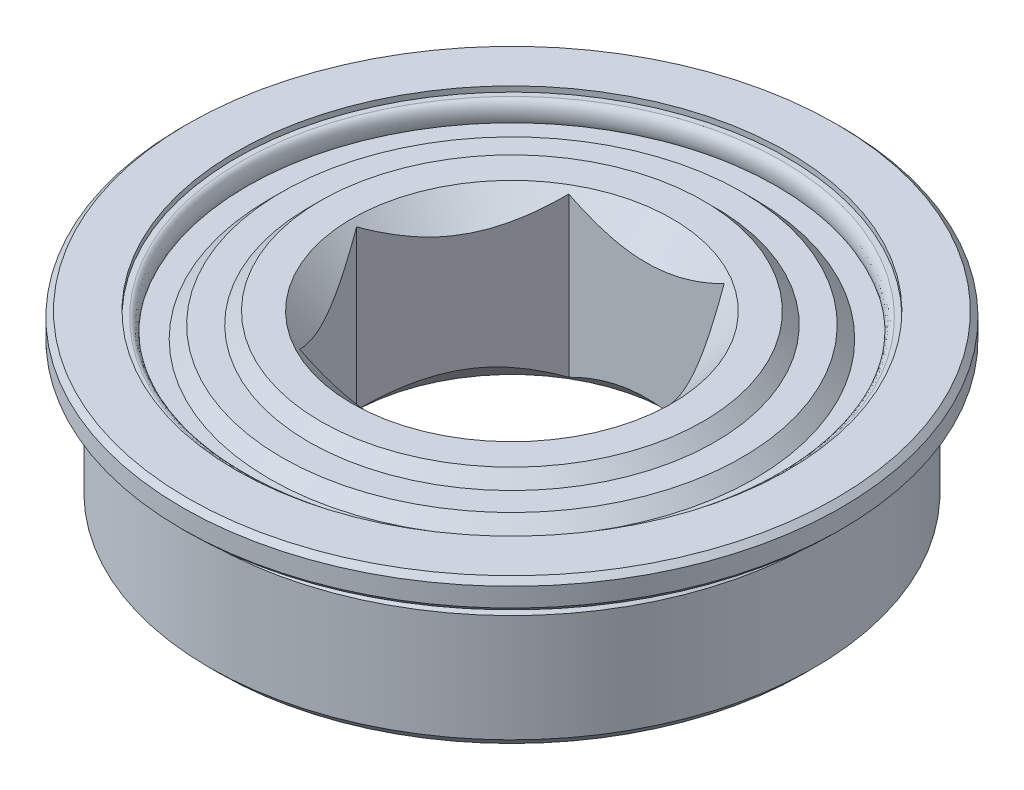
ISO-10303-21;
HEADER;
FILE_DESCRIPTION(('STEP AP214'),'2;1');
FILE_NAME('part.step','',(''),(''),'','','');
FILE_SCHEMA(('AUTOMOTIVE_DESIGN { 1 0 10303 214 1 1 1 1 }'));
ENDSEC;
DATA;
#1=APPLICATION_CONTEXT('core data for automotive mechanical design processes');
#2=APPLICATION_PROTOCOL_DEFINITION('international standard','automotive_design',2000,#1);
#3=PRODUCT_CONTEXT('',#1,'mechanical');
#4=PRODUCT('Part','Part','',(#3));
#5=PRODUCT_RELATED_PRODUCT_CATEGORY('part','',(#4));
#6=PRODUCT_DEFINITION_FORMATION('','',#4);
#7=PRODUCT_DEFINITION_CONTEXT('part definition',#1,'design');
#8=PRODUCT_DEFINITION('design','',#6,#7);
#9=PRODUCT_DEFINITION_SHAPE('','',#8);
#10=(LENGTH_UNIT() NAMED_UNIT(*) SI_UNIT(.MILLI.,.METRE.));
#11=(NAMED_UNIT(*) PLANE_ANGLE_UNIT() SI_UNIT($,.RADIAN.));
#12=(NAMED_UNIT(*) SI_UNIT($,.STERADIAN.) SOLID_ANGLE_UNIT());
#13=UNCERTAINTY_MEASURE_WITH_UNIT(LENGTH_MEASURE(1.E-05),#10,'distance_accuracy_value','');
#14=(GEOMETRIC_REPRESENTATION_CONTEXT(3) GLOBAL_UNCERTAINTY_ASSIGNED_CONTEXT((#13)) GLOBAL_UNIT_ASSIGNED_CONTEXT((#10,
#11,#12)) REPRESENTATION_CONTEXT('',''));
#15=CARTESIAN_POINT('',(0.,0.,0.));
#16=DIRECTION('',(0.,0.,1.));
#17=DIRECTION('',(1.,0.,0.));
#18=AXIS2_PLACEMENT_3D('',#15,#16,#17);
#19=CARTESIAN_POINT('',(0.,-1.524,0.));
#20=DIRECTION('',(0.,-1.,0.));
#21=DIRECTION('',(0.,0.,-1.));
#22=AXIS2_PLACEMENT_3D('',#19,#20,#21);
#23=TOROIDAL_SURFACE('',#22,14.224,0.127);
#24=CARTESIAN_POINT('',(0.,-1.524,0.));
#25=DIRECTION('',(0.,-1.,0.));
#26=DIRECTION('',(0.,0.,-1.));
#27=AXIS2_PLACEMENT_3D('',#24,#25,#26);
#28=CIRCLE('',#27,14.097);
#29=CARTESIAN_POINT('',(0.,-1.524,-14.097));
#30=VERTEX_POINT('',#29);
#31=EDGE_CURVE('E196',#30,#30,#28,.T.);
#32=ORIENTED_EDGE('',*,*,#31,.F.);
#33=EDGE_LOOP('',(#32));
#34=FACE_BOUND('',#33,.T.);
#35=CARTESIAN_POINT('',(0.,-1.397,0.));
#36=DIRECTION('',(0.,1.,0.));
#37=DIRECTION('',(0.,0.,-1.));
#38=AXIS2_PLACEMENT_3D('',#35,#36,#37);
#39=CIRCLE('',#38,14.224);
#40=CARTESIAN_POINT('',(0.,-1.397,-14.224));
#41=VERTEX_POINT('',#40);
#42=EDGE_CURVE('E195',#41,#41,#39,.T.);
#43=ORIENTED_EDGE('',*,*,#42,.F.);
#44=EDGE_LOOP('',(#43));
#45=FACE_BOUND('',#44,.T.);
#46=ADVANCED_FACE('F16',(#34,#45),#23,.F.);
#47=CARTESIAN_POINT('',(7.33234841870825,-7.9375,0.));
#48=DIRECTION('',(0.866025403784439,0.,-0.5));
#49=DIRECTION('',(0.,-1.,0.));
#50=AXIS2_PLACEMENT_3D('',#47,#48,#49);
#51=PLANE('',#50);
#52=CARTESIAN_POINT('',(7.33234841870825,-0.22415158129175,0.));
#53=CARTESIAN_POINT('',(6.86885874856062,-0.68764125143938,-0.802787657479035));
#54=CARTESIAN_POINT('',(6.44960705918636,-0.928142123320571,-1.52895288463434));
#55=CARTESIAN_POINT('',(5.96795144312518,-1.20444058208666,-2.36320488340318));
#56=CARTESIAN_POINT('',(5.50600984993854,-1.2064856558471,-3.16331119293176));
#57=CARTESIAN_POINT('',(5.04374558814999,-1.20853215810218,-3.96397638087285));
#58=CARTESIAN_POINT('',(4.5611815986816,-0.935135019167009,-4.79980172853524));
#59=CARTESIAN_POINT('',(4.13662420852037,-0.694601580458219,-5.53515669902333));
#60=CARTESIAN_POINT('',(3.66617420935412,-0.224151581291739,-6.35000000000001));
#61=B_SPLINE_CURVE_WITH_KNOTS('',2,(#52,#53,#54,#55,#56,#57,#58,#59,#60),.UNSPECIFIED.,.F.,.F.,
(3,2,2,2,3),(0.,0.25,0.5,0.75,1.),.UNSPECIFIED.);
#62=CARTESIAN_POINT('',(7.33234841870825,-0.224151581291754,0.));
#63=VERTEX_POINT('',#62);
#64=CARTESIAN_POINT('',(3.66617420935412,-0.224151581291751,-6.35));
#65=VERTEX_POINT('',#64);
#66=EDGE_CURVE('E491',#63,#65,#61,.T.);
#67=ORIENTED_EDGE('',*,*,#66,.T.);
#68=DIRECTION('',(0.,1.,0.));
#69=VECTOR('',#68,1.);
#70=CARTESIAN_POINT('',(3.66617420935412,-7.9375,-6.35));
#71=LINE('',#70,#69);
#72=CARTESIAN_POINT('',(3.66617420935412,-7.71334841870825,-6.35));
#73=VERTEX_POINT('',#72);
#74=EDGE_CURVE('E11',#73,#65,#71,.T.);
#75=ORIENTED_EDGE('',*,*,#74,.F.);
#76=CARTESIAN_POINT('',(3.66617420935412,-7.71334841870824,-6.35000000000001));
#77=CARTESIAN_POINT('',(4.12966387950616,-7.24985874855621,-5.54721234251334));
#78=CARTESIAN_POINT('',(4.54891556887601,-7.00935787667942,-4.82104711536568));
#79=CARTESIAN_POINT('',(5.03057118494097,-6.73305941791331,-3.98679511659028));
#80=CARTESIAN_POINT('',(5.49251277812383,-6.73101434415289,-3.18668880706825));
#81=CARTESIAN_POINT('',(5.95477703991218,-6.72896784189781,-2.38602361912751));
#82=CARTESIAN_POINT('',(6.43734102938077,-7.00236498083298,-1.55019827146477));
#83=CARTESIAN_POINT('',(6.86189841954177,-7.24289841954153,-0.814843300977084));
#84=CARTESIAN_POINT('',(7.33234841870825,-7.71334841870824,0.));
#85=B_SPLINE_CURVE_WITH_KNOTS('',2,(#76,#77,#78,#79,#80,#81,#82,#83,#84),.UNSPECIFIED.,.F.,.F.,
(3,2,2,2,3),(0.,0.25,0.5,0.75,1.),.UNSPECIFIED.);
#86=CARTESIAN_POINT('',(7.33234841870825,-7.71334841870825,0.));
#87=VERTEX_POINT('',#86);
#88=EDGE_CURVE('E1245',#73,#87,#85,.T.);
#89=ORIENTED_EDGE('',*,*,#88,.T.);
#90=DIRECTION('',(0.,1.,0.));
#91=VECTOR('',#90,1.);
#92=CARTESIAN_POINT('',(7.33234841870825,-7.9375,0.));
#93=LINE('',#92,#91);
#94=EDGE_CURVE('E214',#87,#63,#93,.T.);
#95=ORIENTED_EDGE('',*,*,#94,.T.);
#96=EDGE_LOOP('',(#67,#75,#89,#95));
#97=FACE_BOUND('',#96,.T.);
#98=ADVANCED_FACE('F331',(#97),#51,.F.);
#99=CARTESIAN_POINT('',(3.66617420935412,-7.9375,-6.35));
#100=DIRECTION('',(0.,0.,-1.));
#101=DIRECTION('',(-1.,0.,0.));
#102=AXIS2_PLACEMENT_3D('',#99,#100,#101);
#103=PLANE('',#102);
#104=CARTESIAN_POINT('',(3.66617420935412,-0.22415158129174,-6.35));
#105=CARTESIAN_POINT('',(2.73227432110119,-0.69110152541821,-6.35));
#106=CARTESIAN_POINT('',(1.88795550411408,-0.93178295053179,-6.35));
#107=CARTESIAN_POINT('',(0.925627723468545,-1.20610399728834,-6.35));
#108=CARTESIAN_POINT('',(0.00216765710562509,-1.20649963002069,-6.35));
#109=CARTESIAN_POINT('',(-0.92177943687831,-1.20689547140752,-6.35));
#110=CARTESIAN_POINT('',(-1.8867218260932,-0.93213442667476,-6.35));
#111=CARTESIAN_POINT('',(-2.7310323176977,-0.69172252711998,-6.35));
#112=CARTESIAN_POINT('',(-3.66617420935413,-0.22415158129174,-6.35));
#113=B_SPLINE_CURVE_WITH_KNOTS('',2,(#104,#105,#106,#107,#108,#109,#110,#111,#112),
.UNSPECIFIED.,.F.,.F.,(3,2,2,2,3),(0.,0.25,0.5,0.75,1.),.UNSPECIFIED.);
#114=CARTESIAN_POINT('',(-3.66617420935413,-0.224151581291746,-6.35));
#115=VERTEX_POINT('',#114);
#116=EDGE_CURVE('E497',#65,#115,#113,.T.);
#117=ORIENTED_EDGE('',*,*,#116,.T.);
#118=DIRECTION('',(0.,1.,0.));
#119=VECTOR('',#118,1.);
#120=CARTESIAN_POINT('',(-3.66617420935413,-7.9375,-6.35));
#121=LINE('',#120,#119);
#122=CARTESIAN_POINT('',(-3.66617420935413,-7.71334841870826,-6.35));
#123=VERTEX_POINT('',#122);
#124=EDGE_CURVE('E29',#123,#115,#121,.T.);
#125=ORIENTED_EDGE('',*,*,#124,.F.);
#126=CARTESIAN_POINT('',(-3.66617420935413,-7.71334841870825,-6.35));
#127=CARTESIAN_POINT('',(-2.73160048914318,-7.24606155860275,-6.35));
#128=CARTESIAN_POINT('',(-1.8867218260932,-7.00536557332522,-6.35));
#129=CARTESIAN_POINT('',(-0.9228354387176,-6.73076568833412,-6.35));
#130=CARTESIAN_POINT('',(0.00216765710562986,-6.73100036997929,-6.35));
#131=CARTESIAN_POINT('',(0.92456619557612,-6.73123439082472,-6.35));
#132=CARTESIAN_POINT('',(1.88795550411408,-7.0057170494682,-6.35));
#133=CARTESIAN_POINT('',(2.73169984620938,-7.24611123713587,-6.35));
#134=CARTESIAN_POINT('',(3.66617420935412,-7.71334841870824,-6.35));
#135=B_SPLINE_CURVE_WITH_KNOTS('',2,(#126,#127,#128,#129,#130,#131,#132,#133,#134),
.UNSPECIFIED.,.F.,.F.,(3,2,2,2,3),(0.,0.25,0.5,0.75,1.),.UNSPECIFIED.);
#136=EDGE_CURVE('E1237',#123,#73,#135,.T.);
#137=ORIENTED_EDGE('',*,*,#136,.T.);
#138=ORIENTED_EDGE('',*,*,#74,.T.);
#139=EDGE_LOOP('',(#117,#125,#137,#138));
#140=FACE_BOUND('',#139,.T.);
#141=ADVANCED_FACE('F960',(#140),#103,.F.);
#142=CARTESIAN_POINT('',(-3.66617420935413,-7.9375,-6.35));
#143=DIRECTION('',(-0.866025403784439,0.,-0.5));
#144=DIRECTION('',(-0.5,0.,0.866025403784439));
#145=AXIS2_PLACEMENT_3D('',#142,#143,#144);
#146=PLANE('',#145);
#147=CARTESIAN_POINT('',(-3.66617420935413,-0.224151581291737,-6.35));
#148=CARTESIAN_POINT('',(-4.12966387950116,-0.687641251438776,-5.54721234252199));
#149=CARTESIAN_POINT('',(-4.54891556887602,-0.928142123320557,-4.82104711536567));
#150=CARTESIAN_POINT('',(-5.03057118493667,-1.20444058208665,-3.98679511659772));
#151=CARTESIAN_POINT('',(-5.49251277812383,-1.20648565584709,-3.18668880706824));
#152=CARTESIAN_POINT('',(-5.95477703991238,-1.20853215810217,-2.38602361912716));
#153=CARTESIAN_POINT('',(-6.43734102938078,-0.935135019166996,-1.55019827146476));
#154=CARTESIAN_POINT('',(-6.861898419542,-0.694601580458217,-0.814843300976677));
#155=CARTESIAN_POINT('',(-7.33234841870825,-0.224151581291737,0.));
#156=B_SPLINE_CURVE_WITH_KNOTS('',2,(#147,#148,#149,#150,#151,#152,#153,#154,#155),
.UNSPECIFIED.,.F.,.F.,(3,2,2,2,3),(0.,0.25,0.5,0.75,1.),.UNSPECIFIED.);
#157=CARTESIAN_POINT('',(-7.33234841870825,-0.224151581291749,0.));
#158=VERTEX_POINT('',#157);
#159=EDGE_CURVE('E503',#115,#158,#156,.T.);
#160=ORIENTED_EDGE('',*,*,#159,.T.);
#161=DIRECTION('',(0.,1.,0.));
#162=VECTOR('',#161,1.);
#163=CARTESIAN_POINT('',(-7.33234841870825,-7.9375,0.));
#164=LINE('',#163,#162);
#165=CARTESIAN_POINT('',(-7.33234841870825,-7.71334841870825,0.));
#166=VERTEX_POINT('',#165);
#167=EDGE_CURVE('E409',#166,#158,#164,.T.);
#168=ORIENTED_EDGE('',*,*,#167,.F.);
#169=CARTESIAN_POINT('',(-7.33234841870825,-7.71334841870825,0.));
#170=CARTESIAN_POINT('',(-6.86885874856335,-7.24985874856334,-0.80278765747431));
#171=CARTESIAN_POINT('',(-6.44960705918636,-7.00935787667942,-1.52895288463433));
#172=CARTESIAN_POINT('',(-5.96795144312366,-6.73305941791111,-2.36320488340584));
#173=CARTESIAN_POINT('',(-5.50600984993855,-6.7310143441529,-3.16331119293176));
#174=CARTESIAN_POINT('',(-5.0437455881457,-6.72896784190002,-3.9639763808803));
#175=CARTESIAN_POINT('',(-4.56118159868161,-7.00236498083299,-4.79980172853523));
#176=CARTESIAN_POINT('',(-4.13662420851991,-7.24289841954224,-5.53515669902414));
#177=CARTESIAN_POINT('',(-3.66617420935413,-7.71334841870825,-6.35));
#178=B_SPLINE_CURVE_WITH_KNOTS('',2,(#169,#170,#171,#172,#173,#174,#175,#176,#177),
.UNSPECIFIED.,.F.,.F.,(3,2,2,2,3),(0.,0.25,0.5,0.75,1.),.UNSPECIFIED.);
#179=EDGE_CURVE('E1239',#166,#123,#178,.T.);
#180=ORIENTED_EDGE('',*,*,#179,.T.);
#181=ORIENTED_EDGE('',*,*,#124,.T.);
#182=EDGE_LOOP('',(#160,#168,#180,#181));
#183=FACE_BOUND('',#182,.T.);
#184=ADVANCED_FACE('F383',(#183),#146,.F.);
#185=CARTESIAN_POINT('',(-7.33234841870825,-7.9375,0.));
#186=DIRECTION('',(-0.866025403784439,0.,0.5));
#187=DIRECTION('',(0.,1.,0.));
#188=AXIS2_PLACEMENT_3D('',#185,#186,#187);
#189=PLANE('',#188);
#190=CARTESIAN_POINT('',(-7.33234841870825,-0.22415158129174,0.));
#191=CARTESIAN_POINT('',(-6.86885874856026,-0.68764125143973,0.802787657479657));
#192=CARTESIAN_POINT('',(-6.44960705918636,-0.928142123320571,1.52895288463434));
#193=CARTESIAN_POINT('',(-5.96795144312488,-1.20444058208666,2.36320488340372));
#194=CARTESIAN_POINT('',(-5.50600984993854,-1.20648565584709,3.16331119293176));
#195=CARTESIAN_POINT('',(-5.04374558815039,-1.20853215810217,3.96397638087217));
#196=CARTESIAN_POINT('',(-4.5611815986816,-0.935135019167,4.79980172853524));
#197=CARTESIAN_POINT('',(-4.13662420852084,-0.69460158045868,5.53515669902252));
#198=CARTESIAN_POINT('',(-3.66617420935413,-0.22415158129174,6.35));
#199=B_SPLINE_CURVE_WITH_KNOTS('',2,(#190,#191,#192,#193,#194,#195,#196,#197,#198),
.UNSPECIFIED.,.F.,.F.,(3,2,2,2,3),(0.,0.25,0.5,0.75,1.),.UNSPECIFIED.);
#200=CARTESIAN_POINT('',(-3.66617420935413,-0.224151581291752,6.35));
#201=VERTEX_POINT('',#200);
#202=EDGE_CURVE('E263',#158,#201,#199,.T.);
#203=ORIENTED_EDGE('',*,*,#202,.T.);
#204=DIRECTION('',(0.,1.,0.));
#205=VECTOR('',#204,1.);
#206=CARTESIAN_POINT('',(-3.66617420935413,-7.9375,6.35));
#207=LINE('',#206,#205);
#208=CARTESIAN_POINT('',(-3.66617420935413,-7.71334841870825,6.35));
#209=VERTEX_POINT('',#208);
#210=EDGE_CURVE('E593',#209,#201,#207,.T.);
#211=ORIENTED_EDGE('',*,*,#210,.F.);
#212=CARTESIAN_POINT('',(-3.66617420935412,-7.71334841870824,6.35));
#213=CARTESIAN_POINT('',(-4.12966387951137,-7.249858748551,5.54721234250431));
#214=CARTESIAN_POINT('',(-4.54891556887601,-7.00935787667942,4.82104711536567));
#215=CARTESIAN_POINT('',(-5.03057118494938,-6.73305941791106,3.9867951165757));
#216=CARTESIAN_POINT('',(-5.49251277812383,-6.7310143441529,3.18668880706825));
#217=CARTESIAN_POINT('',(-5.95477703991627,-6.72896784190002,2.38602361912041));
#218=CARTESIAN_POINT('',(-6.43734102938077,-7.00236498083299,1.55019827146477));
#219=CARTESIAN_POINT('',(-6.861898419542,-7.24289841954177,0.814843300976686));
#220=CARTESIAN_POINT('',(-7.33234841870825,-7.71334841870825,0.));
#221=B_SPLINE_CURVE_WITH_KNOTS('',2,(#212,#213,#214,#215,#216,#217,#218,#219,#220),
.UNSPECIFIED.,.F.,.F.,(3,2,2,2,3),(0.,0.25,0.5,0.75,1.),.UNSPECIFIED.);
#222=EDGE_CURVE('E404',#209,#166,#221,.T.);
#223=ORIENTED_EDGE('',*,*,#222,.T.);
#224=ORIENTED_EDGE('',*,*,#167,.T.);
#225=EDGE_LOOP('',(#203,#211,#223,#224));
#226=FACE_BOUND('',#225,.T.);
#227=ADVANCED_FACE('F289',(#226),#189,.F.);
#228=CARTESIAN_POINT('',(-3.66617420935413,-7.9375,6.35));
#229=DIRECTION('',(0.,0.,1.));
#230=DIRECTION('',(0.,-1.,0.));
#231=AXIS2_PLACEMENT_3D('',#228,#229,#230);
#232=PLANE('',#231);
#233=CARTESIAN_POINT('',(-3.66617420935413,-0.22415158129174,6.35));
#234=CARTESIAN_POINT('',(-2.73160048914295,-0.69143844139736,6.35));
#235=CARTESIAN_POINT('',(-1.8867218260932,-0.93213442667477,6.35));
#236=CARTESIAN_POINT('',(-0.922835438717395,-1.20673431166587,6.35));
#237=CARTESIAN_POINT('',(0.00216765710562509,-1.2064996300207,6.35));
#238=CARTESIAN_POINT('',(0.924566195573501,-1.20626560917527,6.35));
#239=CARTESIAN_POINT('',(1.88795550411409,-0.93178295053179,6.35));
#240=CARTESIAN_POINT('',(2.73169984620637,-0.691388762865629,6.35));
#241=CARTESIAN_POINT('',(3.66617420935412,-0.22415158129174,6.35));
#242=B_SPLINE_CURVE_WITH_KNOTS('',2,(#233,#234,#235,#236,#237,#238,#239,#240,#241),
.UNSPECIFIED.,.F.,.F.,(3,2,2,2,3),(0.,0.25,0.5,0.75,1.),.UNSPECIFIED.);
#243=CARTESIAN_POINT('',(3.66617420935412,-0.224151581291752,6.35));
#244=VERTEX_POINT('',#243);
#245=EDGE_CURVE('E236',#201,#244,#242,.T.);
#246=ORIENTED_EDGE('',*,*,#245,.T.);
#247=DIRECTION('',(0.,1.,0.));
#248=VECTOR('',#247,1.);
#249=CARTESIAN_POINT('',(3.66617420935412,-7.9375,6.35));
#250=LINE('',#249,#248);
#251=CARTESIAN_POINT('',(3.66617420935412,-7.71334841870825,6.35));
#252=VERTEX_POINT('',#251);
#253=EDGE_CURVE('E454',#252,#244,#250,.T.);
#254=ORIENTED_EDGE('',*,*,#253,.F.);
#255=CARTESIAN_POINT('',(3.66617420935412,-7.71334841870824,6.35));
#256=CARTESIAN_POINT('',(2.73227432109839,-7.24639847458037,6.35));
#257=CARTESIAN_POINT('',(1.88795550411409,-7.0057170494682,6.35));
#258=CARTESIAN_POINT('',(0.92562772346614,-6.73139600271165,6.35));
#259=CARTESIAN_POINT('',(0.00216765710562509,-6.73100036997929,6.35));
#260=CARTESIAN_POINT('',(-0.92177943688398,-6.73060452859247,6.35));
#261=CARTESIAN_POINT('',(-1.8867218260932,-7.00536557332522,6.35));
#262=CARTESIAN_POINT('',(-2.73103231770423,-7.24577747288327,6.35));
#263=CARTESIAN_POINT('',(-3.66617420935413,-7.71334841870824,6.35));
#264=B_SPLINE_CURVE_WITH_KNOTS('',2,(#255,#256,#257,#258,#259,#260,#261,#262,#263),
.UNSPECIFIED.,.F.,.F.,(3,2,2,2,3),(0.,0.25,0.5,0.75,1.),.UNSPECIFIED.);
#265=EDGE_CURVE('E244',#252,#209,#264,.T.);
#266=ORIENTED_EDGE('',*,*,#265,.T.);
#267=ORIENTED_EDGE('',*,*,#210,.T.);
#268=EDGE_LOOP('',(#246,#254,#266,#267));
#269=FACE_BOUND('',#268,.T.);
#270=ADVANCED_FACE('F278',(#269),#232,.F.);
#271=CARTESIAN_POINT('',(3.66617420935412,-7.9375,6.35));
#272=DIRECTION('',(0.866025403784439,0.,0.5));
#273=DIRECTION('',(0.,-1.,0.));
#274=AXIS2_PLACEMENT_3D('',#271,#272,#273);
#275=PLANE('',#274);
#276=CARTESIAN_POINT('',(3.66617420935413,-0.22415158129174,6.35));
#277=CARTESIAN_POINT('',(4.12966387950282,-0.68764125144044,5.54721234251911));
#278=CARTESIAN_POINT('',(4.54891556887602,-0.928142123320571,4.82104711536566));
#279=CARTESIAN_POINT('',(5.0305711849368,-1.20444058208591,3.98679511659749));
#280=CARTESIAN_POINT('',(5.49251277812383,-1.2064856558471,3.18668880706824));
#281=CARTESIAN_POINT('',(5.95477703991108,-1.20853215810292,2.38602361912941));
#282=CARTESIAN_POINT('',(6.43734102938078,-0.935135019167009,1.55019827146476));
#283=CARTESIAN_POINT('',(6.861898419542,-0.694601580458219,0.814843300976678));
#284=CARTESIAN_POINT('',(7.33234841870825,-0.224151581291749,0.));
#285=B_SPLINE_CURVE_WITH_KNOTS('',2,(#276,#277,#278,#279,#280,#281,#282,#283,#284),
.UNSPECIFIED.,.F.,.F.,(3,2,2,2,3),(0.,0.25,0.5,0.75,1.),.UNSPECIFIED.);
#286=EDGE_CURVE('E487',#244,#63,#285,.T.);
#287=ORIENTED_EDGE('',*,*,#286,.T.);
#288=ORIENTED_EDGE('',*,*,#94,.F.);
#289=CARTESIAN_POINT('',(7.33234841870825,-7.71334841870824,0.));
#290=CARTESIAN_POINT('',(6.86885874856263,-7.24985874856263,0.802787657475541));
#291=CARTESIAN_POINT('',(6.44960705918636,-7.00935787667942,1.52895288463433));
#292=CARTESIAN_POINT('',(5.96795144312693,-6.73305941791334,2.36320488340015));
#293=CARTESIAN_POINT('',(5.50600984993855,-6.73101434415289,3.16331119293175));
#294=CARTESIAN_POINT('',(5.04374558814941,-6.72896784189781,3.96397638087386));
#295=CARTESIAN_POINT('',(4.5611815986816,-7.00236498083298,4.79980172853523));
#296=CARTESIAN_POINT('',(4.13662420851969,-7.24289841954246,5.53515669902451));
#297=CARTESIAN_POINT('',(3.66617420935412,-7.71334841870824,6.35));
#298=B_SPLINE_CURVE_WITH_KNOTS('',2,(#289,#290,#291,#292,#293,#294,#295,#296,#297),
.UNSPECIFIED.,.F.,.F.,(3,2,2,2,3),(0.,0.25,0.5,0.75,1.),.UNSPECIFIED.);
#299=EDGE_CURVE('E235',#87,#252,#298,.T.);
#300=ORIENTED_EDGE('',*,*,#299,.T.);
#301=ORIENTED_EDGE('',*,*,#253,.T.);
#302=EDGE_LOOP('',(#287,#288,#300,#301));
#303=FACE_BOUND('',#302,.T.);
#304=ADVANCED_FACE('F288',(#303),#275,.F.);
#305=CARTESIAN_POINT('',(0.,-6.7945,0.));
#306=DIRECTION('',(0.,-1.,0.));
#307=DIRECTION('',(0.,0.,-1.));
#308=AXIS2_PLACEMENT_3D('',#305,#306,#307);
#309=PLANE('',#308);
#310=CARTESIAN_POINT('',(0.,-6.7945,0.));
#311=DIRECTION('',(0.,1.,0.));
#312=DIRECTION('',(0.,0.,1.));
#313=AXIS2_PLACEMENT_3D('',#310,#311,#312);
#314=CIRCLE('',#313,11.4415517727908);
#315=CARTESIAN_POINT('',(0.,-6.7945,11.4415517727908));
#316=VERTEX_POINT('',#315);
#317=EDGE_CURVE('E42',#316,#316,#314,.T.);
#318=ORIENTED_EDGE('',*,*,#317,.T.);
#319=EDGE_LOOP('',(#318));
#320=FACE_BOUND('',#319,.T.);
#321=CARTESIAN_POINT('',(0.,-6.7945,0.));
#322=DIRECTION('',(0.,1.,0.));
#323=DIRECTION('',(0.,0.,1.));
#324=AXIS2_PLACEMENT_3D('',#321,#322,#323);
#325=CIRCLE('',#324,12.4995052843776);
#326=CARTESIAN_POINT('',(0.,-6.7945,12.4995052843776));
#327=VERTEX_POINT('',#326);
#328=EDGE_CURVE('E191',#327,#327,#325,.T.);
#329=ORIENTED_EDGE('',*,*,#328,.F.);
#330=EDGE_LOOP('',(#329));
#331=FACE_BOUND('',#330,.T.);
#332=ADVANCED_FACE('F386',(#320,#331),#309,.T.);
#333=CARTESIAN_POINT('',(0.,-6.7945,0.));
#334=DIRECTION('',(0.,1.,0.));
#335=DIRECTION('',(0.,0.,1.));
#336=AXIS2_PLACEMENT_3D('',#333,#334,#335);
#337=CONICAL_SURFACE('',#336,11.4415517727908,0.785398163397449);
#338=CARTESIAN_POINT('',(0.,-7.37755177279077,0.));
#339=DIRECTION('',(0.,1.,0.));
#340=DIRECTION('',(0.,0.,1.));
#341=AXIS2_PLACEMENT_3D('',#338,#339,#340);
#342=CIRCLE('',#341,10.8585);
#343=CARTESIAN_POINT('',(0.,-7.37755177279077,10.8585));
#344=VERTEX_POINT('',#343);
#345=EDGE_CURVE('E215',#344,#344,#342,.T.);
#346=ORIENTED_EDGE('',*,*,#345,.T.);
#347=EDGE_LOOP('',(#346));
#348=FACE_BOUND('',#347,.T.);
#349=ORIENTED_EDGE('',*,*,#317,.F.);
#350=EDGE_LOOP('',(#349));
#351=FACE_BOUND('',#350,.T.);
#352=ADVANCED_FACE('F912',(#348,#351),#337,.T.);
#353=CARTESIAN_POINT('',(0.,-7.37755177279077,0.));
#354=DIRECTION('',(0.,-1.,0.));
#355=DIRECTION('',(0.,0.,-1.));
#356=AXIS2_PLACEMENT_3D('',#353,#354,#355);
#357=PLANE('',#356);
#358=CARTESIAN_POINT('',(0.,-7.37755177279077,0.));
#359=DIRECTION('',(0.,1.,0.));
#360=DIRECTION('',(0.,0.,1.));
#361=AXIS2_PLACEMENT_3D('',#358,#359,#360);
#362=CIRCLE('',#361,9.5885);
#363=CARTESIAN_POINT('',(0.,-7.37755177279077,9.5885));
#364=VERTEX_POINT('',#363);
#365=EDGE_CURVE('E221',#364,#364,#362,.T.);
#366=ORIENTED_EDGE('',*,*,#365,.T.);
#367=EDGE_LOOP('',(#366));
#368=FACE_BOUND('',#367,.T.);
#369=ORIENTED_EDGE('',*,*,#345,.F.);
#370=EDGE_LOOP('',(#369));
#371=FACE_BOUND('',#370,.T.);
#372=ADVANCED_FACE('F901',(#368,#371),#357,.T.);
#373=CARTESIAN_POINT('',(0.,-7.37755177279077,0.));
#374=DIRECTION('',(0.,1.,0.));
#375=DIRECTION('',(0.,0.,1.));
#376=AXIS2_PLACEMENT_3D('',#373,#374,#375);
#377=CONICAL_SURFACE('',#376,9.5885,0.785398163397456);
#378=CARTESIAN_POINT('',(0.,-7.9375,0.));
#379=DIRECTION('',(0.,1.,0.));
#380=DIRECTION('',(0.,0.,1.));
#381=AXIS2_PLACEMENT_3D('',#378,#379,#380);
#382=CIRCLE('',#381,9.02855177279076);
#383=CARTESIAN_POINT('',(0.,-7.9375,9.02855177279076));
#384=VERTEX_POINT('',#383);
#385=EDGE_CURVE('E225',#384,#384,#382,.T.);
#386=ORIENTED_EDGE('',*,*,#385,.T.);
#387=EDGE_LOOP('',(#386));
#388=FACE_BOUND('',#387,.T.);
#389=ORIENTED_EDGE('',*,*,#365,.F.);
#390=EDGE_LOOP('',(#389));
#391=FACE_BOUND('',#390,.T.);
#392=ADVANCED_FACE('F891',(#388,#391),#377,.T.);
#393=CARTESIAN_POINT('',(0.,-7.9375,0.));
#394=DIRECTION('',(0.,1.,0.));
#395=DIRECTION('',(0.,0.,-1.));
#396=AXIS2_PLACEMENT_3D('',#393,#394,#395);
#397=PLANE('',#396);
#398=CARTESIAN_POINT('',(0.,-7.9375,0.));
#399=DIRECTION('',(0.,1.,0.));
#400=DIRECTION('',(0.,0.,1.));
#401=AXIS2_PLACEMENT_3D('',#398,#399,#400);
#402=CIRCLE('',#401,7.5565);
#403=CARTESIAN_POINT('',(0.,-7.9375,7.5565));
#404=VERTEX_POINT('',#403);
#405=EDGE_CURVE('E232',#404,#404,#402,.T.);
#406=ORIENTED_EDGE('',*,*,#405,.T.);
#407=EDGE_LOOP('',(#406));
#408=FACE_BOUND('',#407,.T.);
#409=ORIENTED_EDGE('',*,*,#385,.F.);
#410=EDGE_LOOP('',(#409));
#411=FACE_BOUND('',#410,.T.);
#412=ADVANCED_FACE('F420',(#408,#411),#397,.F.);
#413=CARTESIAN_POINT('',(0.,-7.9375,0.));
#414=DIRECTION('',(0.,-1.,0.));
#415=DIRECTION('',(0.,0.,-1.));
#416=AXIS2_PLACEMENT_3D('',#413,#414,#415);
#417=CONICAL_SURFACE('',#416,7.5565,0.785398163397446);
#418=ORIENTED_EDGE('',*,*,#299,.F.);
#419=ORIENTED_EDGE('',*,*,#88,.F.);
#420=ORIENTED_EDGE('',*,*,#136,.F.);
#421=ORIENTED_EDGE('',*,*,#179,.F.);
#422=ORIENTED_EDGE('',*,*,#222,.F.);
#423=ORIENTED_EDGE('',*,*,#265,.F.);
#424=EDGE_LOOP('',(#418,#419,#420,#421,#422,#423));
#425=FACE_BOUND('',#424,.T.);
#426=ORIENTED_EDGE('',*,*,#405,.F.);
#427=EDGE_LOOP('',(#426));
#428=FACE_BOUND('',#427,.T.);
#429=ADVANCED_FACE('F330',(#425,#428),#417,.F.);
#430=CARTESIAN_POINT('',(0.,-1.2065,0.));
#431=DIRECTION('',(0.,1.,0.));
#432=DIRECTION('',(0.,0.,1.));
#433=AXIS2_PLACEMENT_3D('',#430,#431,#432);
#434=CONICAL_SURFACE('',#433,6.35,0.785398163397448);
#435=ORIENTED_EDGE('',*,*,#202,.F.);
#436=ORIENTED_EDGE('',*,*,#159,.F.);
#437=ORIENTED_EDGE('',*,*,#116,.F.);
#438=ORIENTED_EDGE('',*,*,#66,.F.);
#439=ORIENTED_EDGE('',*,*,#286,.F.);
#440=ORIENTED_EDGE('',*,*,#245,.F.);
#441=EDGE_LOOP('',(#435,#436,#437,#438,#439,#440));
#442=FACE_BOUND('',#441,.T.);
#443=CARTESIAN_POINT('',(0.,0.,0.));
#444=DIRECTION('',(0.,1.,0.));
#445=DIRECTION('',(0.,0.,1.));
#446=AXIS2_PLACEMENT_3D('',#443,#444,#445);
#447=CIRCLE('',#446,7.5565);
#448=CARTESIAN_POINT('',(0.,0.,7.5565));
#449=VERTEX_POINT('',#448);
#450=EDGE_CURVE('E255',#449,#449,#447,.T.);
#451=ORIENTED_EDGE('',*,*,#450,.T.);
#452=EDGE_LOOP('',(#451));
#453=FACE_BOUND('',#452,.T.);
#454=ADVANCED_FACE('F319',(#442,#453),#434,.F.);
#455=CARTESIAN_POINT('',(0.,0.,0.));
#456=DIRECTION('',(0.,1.,0.));
#457=DIRECTION('',(0.,0.,-1.));
#458=AXIS2_PLACEMENT_3D('',#455,#456,#457);
#459=PLANE('',#458);
#460=ORIENTED_EDGE('',*,*,#450,.F.);
#461=EDGE_LOOP('',(#460));
#462=FACE_BOUND('',#461,.T.);
#463=CARTESIAN_POINT('',(0.,0.,0.));
#464=DIRECTION('',(0.,1.,0.));
#465=DIRECTION('',(0.,0.,1.));
#466=AXIS2_PLACEMENT_3D('',#463,#464,#465);
#467=CIRCLE('',#466,9.02855177279076);
#468=CARTESIAN_POINT('',(0.,0.,9.02855177279076));
#469=VERTEX_POINT('',#468);
#470=EDGE_CURVE('E231',#469,#469,#467,.T.);
#471=ORIENTED_EDGE('',*,*,#470,.T.);
#472=EDGE_LOOP('',(#471));
#473=FACE_BOUND('',#472,.T.);
#474=ADVANCED_FACE('F329',(#462,#473),#459,.T.);
#475=CARTESIAN_POINT('',(0.,-0.559948227209232,0.));
#476=DIRECTION('',(0.,-1.,0.));
#477=DIRECTION('',(0.,0.,-1.));
#478=AXIS2_PLACEMENT_3D('',#475,#476,#477);
#479=CONICAL_SURFACE('',#478,9.5885,0.785398163397453);
#480=ORIENTED_EDGE('',*,*,#470,.F.);
#481=EDGE_LOOP('',(#480));
#482=FACE_BOUND('',#481,.T.);
#483=CARTESIAN_POINT('',(0.,-0.559948227209232,0.));
#484=DIRECTION('',(0.,1.,0.));
#485=DIRECTION('',(0.,0.,1.));
#486=AXIS2_PLACEMENT_3D('',#483,#484,#485);
#487=CIRCLE('',#486,9.5885);
#488=CARTESIAN_POINT('',(0.,-0.559948227209233,9.5885));
#489=VERTEX_POINT('',#488);
#490=EDGE_CURVE('E228',#489,#489,#487,.T.);
#491=ORIENTED_EDGE('',*,*,#490,.T.);
#492=EDGE_LOOP('',(#491));
#493=FACE_BOUND('',#492,.T.);
#494=ADVANCED_FACE('F476',(#482,#493),#479,.T.);
#495=CARTESIAN_POINT('',(0.,-0.559948227209232,0.));
#496=DIRECTION('',(0.,-1.,0.));
#497=DIRECTION('',(0.,0.,-1.));
#498=AXIS2_PLACEMENT_3D('',#495,#496,#497);
#499=PLANE('',#498);
#500=ORIENTED_EDGE('',*,*,#490,.F.);
#501=EDGE_LOOP('',(#500));
#502=FACE_BOUND('',#501,.T.);
#503=CARTESIAN_POINT('',(0.,-0.559948227209232,0.));
#504=DIRECTION('',(0.,1.,0.));
#505=DIRECTION('',(0.,0.,1.));
#506=AXIS2_PLACEMENT_3D('',#503,#504,#505);
#507=CIRCLE('',#506,10.8585);
#508=CARTESIAN_POINT('',(0.,-0.559948227209233,10.8585));
#509=VERTEX_POINT('',#508);
#510=EDGE_CURVE('E211',#509,#509,#507,.T.);
#511=ORIENTED_EDGE('',*,*,#510,.T.);
#512=EDGE_LOOP('',(#511));
#513=FACE_BOUND('',#512,.T.);
#514=ADVANCED_FACE('F18',(#502,#513),#499,.F.);
#515=CARTESIAN_POINT('',(0.,-1.143,0.));
#516=DIRECTION('',(0.,-1.,0.));
#517=DIRECTION('',(0.,0.,-1.));
#518=AXIS2_PLACEMENT_3D('',#515,#516,#517);
#519=CONICAL_SURFACE('',#518,11.4415517727908,0.785398163397443);
#520=ORIENTED_EDGE('',*,*,#510,.F.);
#521=EDGE_LOOP('',(#520));
#522=FACE_BOUND('',#521,.T.);
#523=CARTESIAN_POINT('',(0.,-1.143,0.));
#524=DIRECTION('',(0.,1.,0.));
#525=DIRECTION('',(0.,0.,1.));
#526=AXIS2_PLACEMENT_3D('',#523,#524,#525);
#527=CIRCLE('',#526,11.4415517727908);
#528=CARTESIAN_POINT('',(0.,-1.143,11.4415517727908));
#529=VERTEX_POINT('',#528);
#530=EDGE_CURVE('E185',#529,#529,#527,.T.);
#531=ORIENTED_EDGE('',*,*,#530,.T.);
#532=EDGE_LOOP('',(#531));
#533=FACE_BOUND('',#532,.T.);
#534=ADVANCED_FACE('F384',(#522,#533),#519,.T.);
#535=CARTESIAN_POINT('',(0.,-1.143,0.));
#536=DIRECTION('',(0.,-1.,0.));
#537=DIRECTION('',(0.,0.,-1.));
#538=AXIS2_PLACEMENT_3D('',#535,#536,#537);
#539=PLANE('',#538);
#540=ORIENTED_EDGE('',*,*,#530,.F.);
#541=EDGE_LOOP('',(#540));
#542=FACE_BOUND('',#541,.T.);
#543=CARTESIAN_POINT('',(0.,-1.143,0.));
#544=DIRECTION('',(0.,1.,0.));
#545=DIRECTION('',(0.,0.,1.));
#546=AXIS2_PLACEMENT_3D('',#543,#544,#545);
#547=CIRCLE('',#546,12.4995052843776);
#548=CARTESIAN_POINT('',(0.,-1.143,12.4995052843776));
#549=VERTEX_POINT('',#548);
#550=EDGE_CURVE('E181',#549,#549,#547,.T.);
#551=ORIENTED_EDGE('',*,*,#550,.T.);
#552=EDGE_LOOP('',(#551));
#553=FACE_BOUND('',#552,.T.);
#554=ADVANCED_FACE('F474',(#542,#553),#539,.F.);
#555=CARTESIAN_POINT('',(0.,-0.254,-12.7635));
#556=CARTESIAN_POINT('',(-25.527,-0.254,-12.7635));
#557=CARTESIAN_POINT('',(-25.527,-0.254000000000003,12.7635));
#558=CARTESIAN_POINT('',(0.,-0.254,12.7635));
#559=CARTESIAN_POINT('',(25.527,-0.254000000000003,12.7635));
#560=CARTESIAN_POINT('',(25.527,-0.254,-12.7635));
#561=CARTESIAN_POINT('',(0.,-0.254,-12.7635));
#562=CARTESIAN_POINT('',(0.,-0.253999999999997,-12.4752486336249));
#563=CARTESIAN_POINT('',(-24.9504972672497,-0.253999999999997,-12.4752486336248));
#564=CARTESIAN_POINT('',(-24.9504972672497,-0.254,12.4752486336248));
#565=CARTESIAN_POINT('',(0.,-0.254,12.4752486336249));
#566=CARTESIAN_POINT('',(24.9504972672497,-0.254,12.4752486336248));
#567=CARTESIAN_POINT('',(24.9504972672497,-0.253999999999997,-12.4752486336248));
#568=CARTESIAN_POINT('',(0.,-0.253999999999997,-12.4752486336249));
#569=CARTESIAN_POINT('',(0.,-0.711584858301911,-12.3393656363914));
#570=CARTESIAN_POINT('',(-24.6787312727828,-0.71158485830191,-12.3393656363914));
#571=CARTESIAN_POINT('',(-24.6787312727828,-0.711584858301915,12.3393656363914));
#572=CARTESIAN_POINT('',(0.,-0.711584858301914,12.3393656363914));
#573=CARTESIAN_POINT('',(24.6787312727828,-0.711584858301915,12.3393656363914));
#574=CARTESIAN_POINT('',(24.6787312727828,-0.71158485830191,-12.3393656363914));
#575=CARTESIAN_POINT('',(0.,-0.711584858301911,-12.3393656363914));
#576=CARTESIAN_POINT('',(0.,-1.143,-12.4995052843776));
#577=CARTESIAN_POINT('',(-24.9990105687552,-1.143,-12.4995052843776));
#578=CARTESIAN_POINT('',(-24.9990105687552,-1.143,12.4995052843776));
#579=CARTESIAN_POINT('',(0.,-1.143,12.4995052843776));
#580=CARTESIAN_POINT('',(24.9990105687552,-1.143,12.4995052843776));
#581=CARTESIAN_POINT('',(24.9990105687552,-1.143,-12.4995052843776));
#582=CARTESIAN_POINT('',(0.,-1.143,-12.4995052843776));
#583=(BOUNDED_SURFACE() B_SPLINE_SURFACE(3,3,((#555,#556,#557,#558,#559,#560,#561),(#562,#563,
#564,#565,#566,#567,#568),(#569,#570,#571,#572,#573,#574,#575),(#576,#577,#578,#579,#580,#581,
#582)),.UNSPECIFIED.,.F.,.T.,.F.) B_SPLINE_SURFACE_WITH_KNOTS((4,4),(4,3,4),(0.,1.),(0.,0.5,1.),
.UNSPECIFIED.) GEOMETRIC_REPRESENTATION_ITEM() RATIONAL_B_SPLINE_SURFACE(((1.,0.333333333333334,
0.333333333333334,1.,0.333333333333334,0.333333333333334,1.),(0.647603013860685,
0.215867671286895,0.215867671286895,0.647603013860685,0.215867671286895,0.215867671286895,
0.647603013860685),(0.647603013860685,0.215867671286895,0.215867671286895,0.647603013860685,
0.215867671286895,0.215867671286895,0.647603013860685),(1.,0.333333333333334,0.333333333333334,
1.,0.333333333333334,0.333333333333334,1.))) REPRESENTATION_ITEM('') SURFACE());
#584=CARTESIAN_POINT('',(0.,-0.254,0.));
#585=DIRECTION('',(0.,1.,0.));
#586=DIRECTION('',(0.,0.,1.));
#587=AXIS2_PLACEMENT_3D('',#584,#585,#586);
#588=CIRCLE('',#587,12.7635);
#589=CARTESIAN_POINT('',(0.,-0.254,12.7635));
#590=VERTEX_POINT('',#589);
#591=EDGE_CURVE('E186',#590,#590,#588,.T.);
#592=ORIENTED_EDGE('',*,*,#550,.F.);
#593=EDGE_LOOP('',(#592));
#594=FACE_BOUND('',#593,.T.);
#595=ORIENTED_EDGE('',*,*,#591,.T.);
#596=EDGE_LOOP('',(#595));
#597=FACE_BOUND('',#596,.T.);
#598=ADVANCED_FACE('F804',(#594,#597),#583,.F.);
#599=CARTESIAN_POINT('',(0.,-0.254,0.));
#600=DIRECTION('',(0.,-1.,0.));
#601=DIRECTION('',(0.,0.,-1.));
#602=AXIS2_PLACEMENT_3D('',#599,#600,#601);
#603=PLANE('',#602);
#604=ORIENTED_EDGE('',*,*,#591,.F.);
#605=EDGE_LOOP('',(#604));
#606=FACE_BOUND('',#605,.T.);
#607=CARTESIAN_POINT('',(0.,-0.254,0.));
#608=DIRECTION('',(0.,1.,0.));
#609=DIRECTION('',(0.,0.,1.));
#610=AXIS2_PLACEMENT_3D('',#607,#608,#609);
#611=CIRCLE('',#610,13.0175);
#612=CARTESIAN_POINT('',(0.,-0.254,13.0175));
#613=VERTEX_POINT('',#612);
#614=EDGE_CURVE('E176',#613,#613,#611,.T.);
#615=ORIENTED_EDGE('',*,*,#614,.T.);
#616=EDGE_LOOP('',(#615));
#617=FACE_BOUND('',#616,.T.);
#618=ADVANCED_FACE('F792',(#606,#617),#603,.F.);
#619=CARTESIAN_POINT('',(0.,0.,0.));
#620=DIRECTION('',(0.,1.,0.));
#621=DIRECTION('',(0.,0.,1.));
#622=AXIS2_PLACEMENT_3D('',#619,#620,#621);
#623=CYLINDRICAL_SURFACE('',#622,13.0175);
#624=ORIENTED_EDGE('',*,*,#614,.F.);
#625=EDGE_LOOP('',(#624));
#626=FACE_BOUND('',#625,.T.);
#627=CARTESIAN_POINT('',(0.,0.,0.));
#628=DIRECTION('',(0.,1.,0.));
#629=DIRECTION('',(0.,0.,1.));
#630=AXIS2_PLACEMENT_3D('',#627,#628,#629);
#631=CIRCLE('',#630,13.0175);
#632=CARTESIAN_POINT('',(0.,0.,13.0175));
#633=VERTEX_POINT('',#632);
#634=EDGE_CURVE('E168',#633,#633,#631,.T.);
#635=ORIENTED_EDGE('',*,*,#634,.T.);
#636=EDGE_LOOP('',(#635));
#637=FACE_BOUND('',#636,.T.);
#638=ADVANCED_FACE('F780',(#626,#637),#623,.F.);
#639=CARTESIAN_POINT('',(0.,0.,0.));
#640=DIRECTION('',(0.,1.,0.));
#641=DIRECTION('',(0.,0.,-1.));
#642=AXIS2_PLACEMENT_3D('',#639,#640,#641);
#643=PLANE('',#642);
#644=ORIENTED_EDGE('',*,*,#634,.F.);
#645=EDGE_LOOP('',(#644));
#646=FACE_BOUND('',#645,.T.);
#647=CARTESIAN_POINT('',(0.,0.,0.));
#648=DIRECTION('',(0.,1.,0.));
#649=DIRECTION('',(0.,0.,1.));
#650=AXIS2_PLACEMENT_3D('',#647,#648,#649);
#651=CIRCLE('',#650,15.3035);
#652=CARTESIAN_POINT('',(0.,0.,15.3035));
#653=VERTEX_POINT('',#652);
#654=EDGE_CURVE('E164',#653,#653,#651,.T.);
#655=ORIENTED_EDGE('',*,*,#654,.T.);
#656=EDGE_LOOP('',(#655));
#657=FACE_BOUND('',#656,.T.);
#658=ADVANCED_FACE('F165',(#646,#657),#643,.T.);
#659=CARTESIAN_POINT('',(0.,0.,0.));
#660=DIRECTION('',(0.,-1.,0.));
#661=DIRECTION('',(0.,0.,-1.));
#662=AXIS2_PLACEMENT_3D('',#659,#660,#661);
#663=CONICAL_SURFACE('',#662,15.3035,0.785398163397457);
#664=ORIENTED_EDGE('',*,*,#654,.F.);
#665=EDGE_LOOP('',(#664));
#666=FACE_BOUND('',#665,.T.);
#667=CARTESIAN_POINT('',(0.,-0.254,0.));
#668=DIRECTION('',(0.,1.,0.));
#669=DIRECTION('',(0.,0.,1.));
#670=AXIS2_PLACEMENT_3D('',#667,#668,#669);
#671=CIRCLE('',#670,15.5575);
#672=CARTESIAN_POINT('',(0.,-0.254,15.5575));
#673=VERTEX_POINT('',#672);
#674=EDGE_CURVE('E169',#673,#673,#671,.T.);
#675=ORIENTED_EDGE('',*,*,#674,.T.);
#676=EDGE_LOOP('',(#675));
#677=FACE_BOUND('',#676,.T.);
#678=ADVANCED_FACE('F760',(#666,#677),#663,.T.);
#679=CARTESIAN_POINT('',(0.,0.,0.));
#680=DIRECTION('',(0.,1.,0.));
#681=DIRECTION('',(0.,0.,1.));
#682=AXIS2_PLACEMENT_3D('',#679,#680,#681);
#683=CYLINDRICAL_SURFACE('',#682,15.5575);
#684=CARTESIAN_POINT('',(0.,-1.143,0.));
#685=DIRECTION('',(0.,1.,0.));
#686=DIRECTION('',(0.,0.,1.));
#687=AXIS2_PLACEMENT_3D('',#684,#685,#686);
#688=CIRCLE('',#687,15.5575);
#689=CARTESIAN_POINT('',(0.,-1.143,15.5575));
#690=VERTEX_POINT('',#689);
#691=EDGE_CURVE('E178',#690,#690,#688,.T.);
#692=ORIENTED_EDGE('',*,*,#691,.T.);
#693=EDGE_LOOP('',(#692));
#694=FACE_BOUND('',#693,.T.);
#695=ORIENTED_EDGE('',*,*,#674,.F.);
#696=EDGE_LOOP('',(#695));
#697=FACE_BOUND('',#696,.T.);
#698=ADVANCED_FACE('F748',(#694,#697),#683,.T.);
#699=CARTESIAN_POINT('',(0.,-1.397,0.));
#700=DIRECTION('',(0.,1.,0.));
#701=DIRECTION('',(0.,0.,1.));
#702=AXIS2_PLACEMENT_3D('',#699,#700,#701);
#703=CONICAL_SURFACE('',#702,15.3035,0.785398163397453);
#704=CARTESIAN_POINT('',(0.,-1.397,0.));
#705=DIRECTION('',(0.,1.,0.));
#706=DIRECTION('',(0.,0.,1.));
#707=AXIS2_PLACEMENT_3D('',#704,#705,#706);
#708=CIRCLE('',#707,15.3035);
#709=CARTESIAN_POINT('',(0.,-1.397,15.3035));
#710=VERTEX_POINT('',#709);
#711=EDGE_CURVE('E192',#710,#710,#708,.T.);
#712=ORIENTED_EDGE('',*,*,#711,.T.);
#713=EDGE_LOOP('',(#712));
#714=FACE_BOUND('',#713,.T.);
#715=ORIENTED_EDGE('',*,*,#691,.F.);
#716=EDGE_LOOP('',(#715));
#717=FACE_BOUND('',#716,.T.);
#718=ADVANCED_FACE('F422',(#714,#717),#703,.T.);
#719=CARTESIAN_POINT('',(0.,-1.397,0.));
#720=DIRECTION('',(0.,-1.,0.));
#721=DIRECTION('',(0.,0.,-1.));
#722=AXIS2_PLACEMENT_3D('',#719,#720,#721);
#723=PLANE('',#722);
#724=ORIENTED_EDGE('',*,*,#42,.T.);
#725=EDGE_LOOP('',(#724));
#726=FACE_BOUND('',#725,.T.);
#727=ORIENTED_EDGE('',*,*,#711,.F.);
#728=EDGE_LOOP('',(#727));
#729=FACE_BOUND('',#728,.T.);
#730=ADVANCED_FACE('F421',(#726,#729),#723,.T.);
#731=CARTESIAN_POINT('',(0.,0.,0.));
#732=DIRECTION('',(0.,1.,0.));
#733=DIRECTION('',(0.,0.,1.));
#734=AXIS2_PLACEMENT_3D('',#731,#732,#733);
#735=CYLINDRICAL_SURFACE('',#734,14.097);
#736=ORIENTED_EDGE('',*,*,#31,.T.);
#737=EDGE_LOOP('',(#736));
#738=FACE_BOUND('',#737,.T.);
#739=CARTESIAN_POINT('',(0.,-2.159,0.));
#740=DIRECTION('',(0.,1.,0.));
#741=DIRECTION('',(0.,0.,1.));
#742=AXIS2_PLACEMENT_3D('',#739,#740,#741);
#743=CIRCLE('',#742,14.097);
#744=CARTESIAN_POINT('',(0.,-2.159,14.097));
#745=VERTEX_POINT('',#744);
#746=EDGE_CURVE('E239',#745,#745,#743,.T.);
#747=ORIENTED_EDGE('',*,*,#746,.T.);
#748=EDGE_LOOP('',(#747));
#749=FACE_BOUND('',#748,.T.);
#750=ADVANCED_FACE('F714',(#738,#749),#735,.T.);
#751=CARTESIAN_POINT('',(0.,-2.3495,0.));
#752=DIRECTION('',(0.,-1.,0.));
#753=DIRECTION('',(0.,0.,-1.));
#754=AXIS2_PLACEMENT_3D('',#751,#752,#753);
#755=CONICAL_SURFACE('',#754,14.2875,0.785398163397452);
#756=ORIENTED_EDGE('',*,*,#746,.F.);
#757=EDGE_LOOP('',(#756));
#758=FACE_BOUND('',#757,.T.);
#759=CARTESIAN_POINT('',(0.,-2.3495,0.));
#760=DIRECTION('',(0.,1.,0.));
#761=DIRECTION('',(0.,0.,1.));
#762=AXIS2_PLACEMENT_3D('',#759,#760,#761);
#763=CIRCLE('',#762,14.2875);
#764=CARTESIAN_POINT('',(0.,-2.3495,14.2875));
#765=VERTEX_POINT('',#764);
#766=EDGE_CURVE('E249',#765,#765,#763,.T.);
#767=ORIENTED_EDGE('',*,*,#766,.T.);
#768=EDGE_LOOP('',(#767));
#769=FACE_BOUND('',#768,.T.);
#770=ADVANCED_FACE('F700',(#758,#769),#755,.T.);
#771=CARTESIAN_POINT('',(0.,0.,0.));
#772=DIRECTION('',(0.,1.,0.));
#773=DIRECTION('',(0.,0.,1.));
#774=AXIS2_PLACEMENT_3D('',#771,#772,#773);
#775=CYLINDRICAL_SURFACE('',#774,14.2875);
#776=CARTESIAN_POINT('',(0.,-7.4295,0.));
#777=DIRECTION('',(0.,1.,0.));
#778=DIRECTION('',(0.,0.,1.));
#779=AXIS2_PLACEMENT_3D('',#776,#777,#778);
#780=CIRCLE('',#779,14.2875);
#781=CARTESIAN_POINT('',(0.,-7.4295,14.2875));
#782=VERTEX_POINT('',#781);
#783=EDGE_CURVE('E250',#782,#782,#780,.T.);
#784=ORIENTED_EDGE('',*,*,#783,.T.);
#785=EDGE_LOOP('',(#784));
#786=FACE_BOUND('',#785,.T.);
#787=ORIENTED_EDGE('',*,*,#766,.F.);
#788=EDGE_LOOP('',(#787));
#789=FACE_BOUND('',#788,.T.);
#790=ADVANCED_FACE('F687',(#786,#789),#775,.T.);
#791=CARTESIAN_POINT('',(0.,-7.4295,0.));
#792=DIRECTION('',(0.,1.,0.));
#793=DIRECTION('',(0.,0.,1.));
#794=AXIS2_PLACEMENT_3D('',#791,#792,#793);
#795=CONICAL_SURFACE('',#794,14.2875,0.785398163397443);
#796=CARTESIAN_POINT('',(0.,-7.9375,0.));
#797=DIRECTION('',(0.,1.,0.));
#798=DIRECTION('',(0.,0.,1.));
#799=AXIS2_PLACEMENT_3D('',#796,#797,#798);
#800=CIRCLE('',#799,13.7795);
#801=CARTESIAN_POINT('',(0.,-7.9375,13.7795));
#802=VERTEX_POINT('',#801);
#803=EDGE_CURVE('E206',#802,#802,#800,.T.);
#804=ORIENTED_EDGE('',*,*,#803,.T.);
#805=EDGE_LOOP('',(#804));
#806=FACE_BOUND('',#805,.T.);
#807=ORIENTED_EDGE('',*,*,#783,.F.);
#808=EDGE_LOOP('',(#807));
#809=FACE_BOUND('',#808,.T.);
#810=ADVANCED_FACE('F675',(#806,#809),#795,.T.);
#811=CARTESIAN_POINT('',(0.,-7.9375,0.));
#812=DIRECTION('',(0.,-1.,0.));
#813=DIRECTION('',(0.,0.,-1.));
#814=AXIS2_PLACEMENT_3D('',#811,#812,#813);
#815=PLANE('',#814);
#816=CARTESIAN_POINT('',(0.,-7.9375,0.));
#817=DIRECTION('',(0.,1.,0.));
#818=DIRECTION('',(0.,0.,1.));
#819=AXIS2_PLACEMENT_3D('',#816,#817,#818);
#820=CIRCLE('',#819,13.0175);
#821=CARTESIAN_POINT('',(0.,-7.9375,13.0175));
#822=VERTEX_POINT('',#821);
#823=EDGE_CURVE('E204',#822,#822,#820,.T.);
#824=ORIENTED_EDGE('',*,*,#823,.T.);
#825=EDGE_LOOP('',(#824));
#826=FACE_BOUND('',#825,.T.);
#827=ORIENTED_EDGE('',*,*,#803,.F.);
#828=EDGE_LOOP('',(#827));
#829=FACE_BOUND('',#828,.T.);
#830=ADVANCED_FACE('F334',(#826,#829),#815,.T.);
#831=CARTESIAN_POINT('',(0.,0.,0.));
#832=DIRECTION('',(0.,1.,0.));
#833=DIRECTION('',(0.,0.,1.));
#834=AXIS2_PLACEMENT_3D('',#831,#832,#833);
#835=CYLINDRICAL_SURFACE('',#834,13.0175);
#836=CARTESIAN_POINT('',(0.,-7.6835,0.));
#837=DIRECTION('',(0.,1.,0.));
#838=DIRECTION('',(0.,0.,1.));
#839=AXIS2_PLACEMENT_3D('',#836,#837,#838);
#840=CIRCLE('',#839,13.0175);
#841=CARTESIAN_POINT('',(0.,-7.6835,13.0175));
#842=VERTEX_POINT('',#841);
#843=EDGE_CURVE('E203',#842,#842,#840,.T.);
#844=ORIENTED_EDGE('',*,*,#843,.T.);
#845=EDGE_LOOP('',(#844));
#846=FACE_BOUND('',#845,.T.);
#847=ORIENTED_EDGE('',*,*,#823,.F.);
#848=EDGE_LOOP('',(#847));
#849=FACE_BOUND('',#848,.T.);
#850=ADVANCED_FACE('F650',(#846,#849),#835,.F.);
#851=CARTESIAN_POINT('',(0.,-7.6835,0.));
#852=DIRECTION('',(0.,-1.,0.));
#853=DIRECTION('',(0.,0.,-1.));
#854=AXIS2_PLACEMENT_3D('',#851,#852,#853);
#855=PLANE('',#854);
#856=CARTESIAN_POINT('',(0.,-7.6835,0.));
#857=DIRECTION('',(0.,1.,0.));
#858=DIRECTION('',(0.,0.,1.));
#859=AXIS2_PLACEMENT_3D('',#856,#857,#858);
#860=CIRCLE('',#859,12.7635);
#861=CARTESIAN_POINT('',(0.,-7.6835,12.7635));
#862=VERTEX_POINT('',#861);
#863=EDGE_CURVE('E187',#862,#862,#860,.T.);
#864=ORIENTED_EDGE('',*,*,#863,.T.);
#865=EDGE_LOOP('',(#864));
#866=FACE_BOUND('',#865,.T.);
#867=ORIENTED_EDGE('',*,*,#843,.F.);
#868=EDGE_LOOP('',(#867));
#869=FACE_BOUND('',#868,.T.);
#870=ADVANCED_FACE('F636',(#866,#869),#855,.T.);
#871=CARTESIAN_POINT('',(0.,-7.6835,-12.7635));
#872=CARTESIAN_POINT('',(-25.527,-7.68349999999999,-12.7635));
#873=CARTESIAN_POINT('',(-25.527,-7.68349999999999,12.7635));
#874=CARTESIAN_POINT('',(0.,-7.6835,12.7635));
#875=CARTESIAN_POINT('',(25.527,-7.68349999999999,12.7635));
#876=CARTESIAN_POINT('',(25.527,-7.68349999999999,-12.7635));
#877=CARTESIAN_POINT('',(0.,-7.6835,-12.7635));
#878=CARTESIAN_POINT('',(0.,-7.6835,-12.4752486336249));
#879=CARTESIAN_POINT('',(-24.9504972672497,-7.68349999999999,-12.4752486336248));
#880=CARTESIAN_POINT('',(-24.9504972672497,-7.68349999999999,12.4752486336248));
#881=CARTESIAN_POINT('',(0.,-7.68350000000001,12.4752486336249));
#882=CARTESIAN_POINT('',(24.9504972672497,-7.68349999999999,12.4752486336248));
#883=CARTESIAN_POINT('',(24.9504972672497,-7.68349999999999,-12.4752486336248));
#884=CARTESIAN_POINT('',(0.,-7.6835,-12.4752486336249));
#885=CARTESIAN_POINT('',(0.,-7.22591514169809,-12.3393656363914));
#886=CARTESIAN_POINT('',(-24.6787312727828,-7.22591514169809,-12.3393656363914));
#887=CARTESIAN_POINT('',(-24.6787312727828,-7.22591514169809,12.3393656363914));
#888=CARTESIAN_POINT('',(0.,-7.22591514169809,12.3393656363914));
#889=CARTESIAN_POINT('',(24.6787312727828,-7.22591514169809,12.3393656363914));
#890=CARTESIAN_POINT('',(24.6787312727828,-7.22591514169809,-12.3393656363914));
#891=CARTESIAN_POINT('',(0.,-7.22591514169809,-12.3393656363914));
#892=CARTESIAN_POINT('',(0.,-6.7945,-12.4995052843776));
#893=CARTESIAN_POINT('',(-24.9990105687552,-6.79449999999999,-12.4995052843776));
#894=CARTESIAN_POINT('',(-24.9990105687552,-6.7945,12.4995052843776));
#895=CARTESIAN_POINT('',(0.,-6.7945,12.4995052843776));
#896=CARTESIAN_POINT('',(24.9990105687552,-6.7945,12.4995052843776));
#897=CARTESIAN_POINT('',(24.9990105687552,-6.79449999999999,-12.4995052843776));
#898=CARTESIAN_POINT('',(0.,-6.7945,-12.4995052843776));
#899=(BOUNDED_SURFACE() B_SPLINE_SURFACE(3,3,((#871,#872,#873,#874,#875,#876,#877),(#878,#879,
#880,#881,#882,#883,#884),(#885,#886,#887,#888,#889,#890,#891),(#892,#893,#894,#895,#896,#897,
#898)),.UNSPECIFIED.,.F.,.T.,.F.) B_SPLINE_SURFACE_WITH_KNOTS((4,4),(4,3,4),(0.,1.),(0.,0.5,1.),
.UNSPECIFIED.) GEOMETRIC_REPRESENTATION_ITEM() RATIONAL_B_SPLINE_SURFACE(((1.,0.333333333333334,
0.333333333333334,1.,0.333333333333334,0.333333333333334,1.),(0.647603013860686,
0.215867671286896,0.215867671286896,0.647603013860686,0.215867671286896,0.215867671286896,
0.647603013860686),(0.647603013860686,0.215867671286896,0.215867671286896,0.647603013860686,
0.215867671286896,0.215867671286896,0.647603013860686),(1.,0.333333333333334,0.333333333333334,
1.,0.333333333333334,0.333333333333334,1.))) REPRESENTATION_ITEM('') SURFACE());
#900=ORIENTED_EDGE('',*,*,#328,.T.);
#901=EDGE_LOOP('',(#900));
#902=FACE_BOUND('',#901,.T.);
#903=ORIENTED_EDGE('',*,*,#863,.F.);
#904=EDGE_LOOP('',(#903));
#905=FACE_BOUND('',#904,.T.);
#906=ADVANCED_FACE('F290',(#902,#905),#899,.T.);
#907=CLOSED_SHELL('',(#46,#98,#141,#184,#227,#270,#304,#332,#352,#372,#392,#412,#429,#454,#474,
#494,#514,#534,#554,#598,#618,#638,#658,#678,#698,#718,#730,#750,#770,#790,#810,#830,#850,#870,#906));
#908=MANIFOLD_SOLID_BREP('B1',#907);
#909=ADVANCED_BREP_SHAPE_REPRESENTATION('',(#18,#908),#14);
#910=SHAPE_DEFINITION_REPRESENTATION(#9,#909);
ENDSEC;
END-ISO-10303-21;
